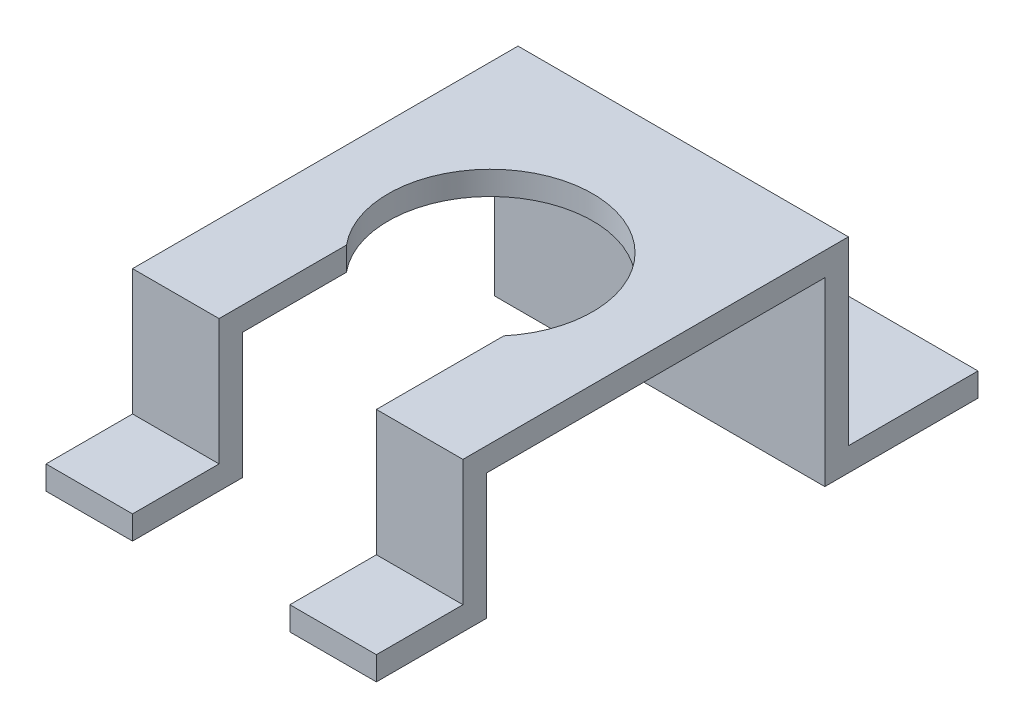
ISO-10303-21;
HEADER;
FILE_DESCRIPTION(('STEP AP214'),'2;1');
FILE_NAME('part.step','',(''),(''),'','','');
FILE_SCHEMA(('AUTOMOTIVE_DESIGN { 1 0 10303 214 1 1 1 1 }'));
ENDSEC;
DATA;
#1=APPLICATION_CONTEXT('core data for automotive mechanical design processes');
#2=APPLICATION_PROTOCOL_DEFINITION('international standard','automotive_design',2000,#1);
#3=PRODUCT_CONTEXT('',#1,'mechanical');
#4=PRODUCT('Part','Part','',(#3));
#5=PRODUCT_RELATED_PRODUCT_CATEGORY('part','',(#4));
#6=PRODUCT_DEFINITION_FORMATION('','',#4);
#7=PRODUCT_DEFINITION_CONTEXT('part definition',#1,'design');
#8=PRODUCT_DEFINITION('design','',#6,#7);
#9=PRODUCT_DEFINITION_SHAPE('','',#8);
#10=(LENGTH_UNIT() NAMED_UNIT(*) SI_UNIT(.MILLI.,.METRE.));
#11=(NAMED_UNIT(*) PLANE_ANGLE_UNIT() SI_UNIT($,.RADIAN.));
#12=(NAMED_UNIT(*) SI_UNIT($,.STERADIAN.) SOLID_ANGLE_UNIT());
#13=UNCERTAINTY_MEASURE_WITH_UNIT(LENGTH_MEASURE(1.E-05),#10,'distance_accuracy_value','');
#14=(GEOMETRIC_REPRESENTATION_CONTEXT(3) GLOBAL_UNCERTAINTY_ASSIGNED_CONTEXT((#13)) GLOBAL_UNIT_ASSIGNED_CONTEXT((#10,
#11,#12)) REPRESENTATION_CONTEXT('',''));
#15=CARTESIAN_POINT('',(0.,0.,0.));
#16=DIRECTION('',(0.,0.,1.));
#17=DIRECTION('',(1.,0.,0.));
#18=AXIS2_PLACEMENT_3D('',#15,#16,#17);
#19=CARTESIAN_POINT('',(42.,26.,-28.5887484860093));
#20=DIRECTION('',(0.,0.,-1.));
#21=DIRECTION('',(0.,1.,0.));
#22=AXIS2_PLACEMENT_3D('',#19,#20,#21);
#23=PLANE('',#22);
#24=DIRECTION('',(-1.,0.,0.));
#25=VECTOR('',#24,1.);
#26=CARTESIAN_POINT('',(42.,10.,-28.5887484860093));
#27=LINE('',#26,#25);
#28=CARTESIAN_POINT('',(11.,10.,-28.5887484860093));
#29=VERTEX_POINT('',#28);
#30=CARTESIAN_POINT('',(0.,10.,-28.5887484860093));
#31=VERTEX_POINT('',#30);
#32=EDGE_CURVE('E279',#29,#31,#27,.T.);
#33=ORIENTED_EDGE('',*,*,#32,.F.);
#34=DIRECTION('',(0.,1.,0.));
#35=VECTOR('',#34,1.);
#36=CARTESIAN_POINT('',(11.,26.,-28.5887484860093));
#37=LINE('',#36,#35);
#38=CARTESIAN_POINT('',(11.,26.,-28.5887484860093));
#39=VERTEX_POINT('',#38);
#40=EDGE_CURVE('E211',#29,#39,#37,.T.);
#41=ORIENTED_EDGE('',*,*,#40,.T.);
#42=DIRECTION('',(-1.,0.,0.));
#43=VECTOR('',#42,1.);
#44=CARTESIAN_POINT('',(42.,26.,-28.5887484860093));
#45=LINE('',#44,#43);
#46=CARTESIAN_POINT('',(0.,26.,-28.5887484860093));
#47=VERTEX_POINT('',#46);
#48=EDGE_CURVE('E284',#39,#47,#45,.T.);
#49=ORIENTED_EDGE('',*,*,#48,.T.);
#50=DIRECTION('',(0.,-1.,0.));
#51=VECTOR('',#50,1.);
#52=CARTESIAN_POINT('',(0.,26.,-28.5887484860093));
#53=LINE('',#52,#51);
#54=EDGE_CURVE('E215',#47,#31,#53,.T.);
#55=ORIENTED_EDGE('',*,*,#54,.T.);
#56=EDGE_LOOP('',(#33,#41,#49,#55));
#57=FACE_BOUND('',#56,.T.);
#58=ADVANCED_FACE('F43',(#57),#23,.F.);
#59=CARTESIAN_POINT('',(42.,10.,-28.5887484860093));
#60=DIRECTION('',(0.,-1.,0.));
#61=DIRECTION('',(0.,0.,-1.));
#62=AXIS2_PLACEMENT_3D('',#59,#60,#61);
#63=PLANE('',#62);
#64=DIRECTION('',(-1.,0.,0.));
#65=VECTOR('',#64,1.);
#66=CARTESIAN_POINT('',(42.,10.,-17.5887484860093));
#67=LINE('',#66,#65);
#68=CARTESIAN_POINT('',(11.,10.,-17.5887484860093));
#69=VERTEX_POINT('',#68);
#70=CARTESIAN_POINT('',(0.,10.,-17.5887484860093));
#71=VERTEX_POINT('',#70);
#72=EDGE_CURVE('E274',#69,#71,#67,.T.);
#73=ORIENTED_EDGE('',*,*,#72,.F.);
#74=DIRECTION('',(0.,0.,-1.));
#75=VECTOR('',#74,1.);
#76=CARTESIAN_POINT('',(11.,10.,-28.5887484860093));
#77=LINE('',#76,#75);
#78=EDGE_CURVE('E359',#69,#29,#77,.T.);
#79=ORIENTED_EDGE('',*,*,#78,.T.);
#80=ORIENTED_EDGE('',*,*,#32,.T.);
#81=DIRECTION('',(0.,0.,1.));
#82=VECTOR('',#81,1.);
#83=CARTESIAN_POINT('',(0.,10.,-28.5887484860093));
#84=LINE('',#83,#82);
#85=EDGE_CURVE('E219',#31,#71,#84,.T.);
#86=ORIENTED_EDGE('',*,*,#85,.T.);
#87=EDGE_LOOP('',(#73,#79,#80,#86));
#88=FACE_BOUND('',#87,.T.);
#89=ADVANCED_FACE('F468',(#88),#63,.F.);
#90=CARTESIAN_POINT('',(42.,10.,-17.5887484860093));
#91=DIRECTION('',(0.,0.,-1.));
#92=DIRECTION('',(-1.,0.,0.));
#93=AXIS2_PLACEMENT_3D('',#90,#91,#92);
#94=PLANE('',#93);
#95=DIRECTION('',(-1.,0.,0.));
#96=VECTOR('',#95,1.);
#97=CARTESIAN_POINT('',(42.,7.,-17.5887484860093));
#98=LINE('',#97,#96);
#99=CARTESIAN_POINT('',(11.,7.,-17.5887484860093));
#100=VERTEX_POINT('',#99);
#101=CARTESIAN_POINT('',(0.,7.,-17.5887484860093));
#102=VERTEX_POINT('',#101);
#103=EDGE_CURVE('E269',#100,#102,#98,.T.);
#104=ORIENTED_EDGE('',*,*,#103,.F.);
#105=DIRECTION('',(0.,1.,0.));
#106=VECTOR('',#105,1.);
#107=CARTESIAN_POINT('',(11.,0.,-17.5887484860093));
#108=LINE('',#107,#106);
#109=EDGE_CURVE('E321',#100,#69,#108,.T.);
#110=ORIENTED_EDGE('',*,*,#109,.T.);
#111=ORIENTED_EDGE('',*,*,#72,.T.);
#112=DIRECTION('',(0.,-1.,0.));
#113=VECTOR('',#112,1.);
#114=CARTESIAN_POINT('',(0.,10.,-17.5887484860093));
#115=LINE('',#114,#113);
#116=EDGE_CURVE('E223',#71,#102,#115,.T.);
#117=ORIENTED_EDGE('',*,*,#116,.T.);
#118=EDGE_LOOP('',(#104,#110,#111,#117));
#119=FACE_BOUND('',#118,.T.);
#120=ADVANCED_FACE('F487',(#119),#94,.F.);
#121=CARTESIAN_POINT('',(42.,7.,-17.5887484860093));
#122=DIRECTION('',(0.,1.,0.));
#123=DIRECTION('',(0.,0.,1.));
#124=AXIS2_PLACEMENT_3D('',#121,#122,#123);
#125=PLANE('',#124);
#126=DIRECTION('',(-1.,0.,0.));
#127=VECTOR('',#126,1.);
#128=CARTESIAN_POINT('',(42.,7.,-31.5887484860093));
#129=LINE('',#128,#127);
#130=CARTESIAN_POINT('',(11.,7.,-31.5887484860093));
#131=VERTEX_POINT('',#130);
#132=CARTESIAN_POINT('',(0.,7.,-31.5887484860093));
#133=VERTEX_POINT('',#132);
#134=EDGE_CURVE('E264',#131,#133,#129,.T.);
#135=ORIENTED_EDGE('',*,*,#134,.F.);
#136=DIRECTION('',(0.,0.,1.));
#137=VECTOR('',#136,1.);
#138=CARTESIAN_POINT('',(11.,7.,-17.5887484860093));
#139=LINE('',#138,#137);
#140=EDGE_CURVE('E355',#131,#100,#139,.T.);
#141=ORIENTED_EDGE('',*,*,#140,.T.);
#142=ORIENTED_EDGE('',*,*,#103,.T.);
#143=DIRECTION('',(0.,0.,-1.));
#144=VECTOR('',#143,1.);
#145=CARTESIAN_POINT('',(0.,7.,-17.5887484860093));
#146=LINE('',#145,#144);
#147=EDGE_CURVE('E227',#102,#133,#146,.T.);
#148=ORIENTED_EDGE('',*,*,#147,.T.);
#149=EDGE_LOOP('',(#135,#141,#142,#148));
#150=FACE_BOUND('',#149,.T.);
#151=ADVANCED_FACE('F484',(#150),#125,.F.);
#152=CARTESIAN_POINT('',(42.,7.,-31.5887484860093));
#153=DIRECTION('',(0.,0.,1.));
#154=DIRECTION('',(1.,0.,0.));
#155=AXIS2_PLACEMENT_3D('',#152,#153,#154);
#156=PLANE('',#155);
#157=DIRECTION('',(-1.,0.,0.));
#158=VECTOR('',#157,1.);
#159=CARTESIAN_POINT('',(42.,23.,-31.5887484860093));
#160=LINE('',#159,#158);
#161=CARTESIAN_POINT('',(11.,23.,-31.5887484860093));
#162=VERTEX_POINT('',#161);
#163=CARTESIAN_POINT('',(0.,23.,-31.5887484860093));
#164=VERTEX_POINT('',#163);
#165=EDGE_CURVE('E259',#162,#164,#160,.T.);
#166=ORIENTED_EDGE('',*,*,#165,.F.);
#167=DIRECTION('',(0.,-1.,0.));
#168=VECTOR('',#167,1.);
#169=CARTESIAN_POINT('',(11.,7.,-31.5887484860093));
#170=LINE('',#169,#168);
#171=EDGE_CURVE('E351',#162,#131,#170,.T.);
#172=ORIENTED_EDGE('',*,*,#171,.T.);
#173=ORIENTED_EDGE('',*,*,#134,.T.);
#174=DIRECTION('',(0.,1.,0.));
#175=VECTOR('',#174,1.);
#176=CARTESIAN_POINT('',(0.,7.,-31.5887484860093));
#177=LINE('',#176,#175);
#178=EDGE_CURVE('E231',#133,#164,#177,.T.);
#179=ORIENTED_EDGE('',*,*,#178,.T.);
#180=EDGE_LOOP('',(#166,#172,#173,#179));
#181=FACE_BOUND('',#180,.T.);
#182=ADVANCED_FACE('F479',(#181),#156,.F.);
#183=CARTESIAN_POINT('',(42.,3.,-77.5887484860093));
#184=DIRECTION('',(0.,0.,1.));
#185=DIRECTION('',(1.,0.,0.));
#186=AXIS2_PLACEMENT_3D('',#183,#184,#185);
#187=PLANE('',#186);
#188=DIRECTION('',(0.,1.,0.));
#189=VECTOR('',#188,1.);
#190=CARTESIAN_POINT('',(0.,3.,-77.5887484860093));
#191=LINE('',#190,#189);
#192=CARTESIAN_POINT('',(0.,3.,-77.5887484860093));
#193=VERTEX_POINT('',#192);
#194=CARTESIAN_POINT('',(0.,26.,-77.5887484860093));
#195=VERTEX_POINT('',#194);
#196=EDGE_CURVE('E206',#193,#195,#191,.T.);
#197=ORIENTED_EDGE('',*,*,#196,.T.);
#198=DIRECTION('',(-1.,0.,0.));
#199=VECTOR('',#198,1.);
#200=CARTESIAN_POINT('',(42.,26.,-77.5887484860093));
#201=LINE('',#200,#199);
#202=CARTESIAN_POINT('',(42.,26.,-77.5887484860093));
#203=VERTEX_POINT('',#202);
#204=EDGE_CURVE('E289',#203,#195,#201,.T.);
#205=ORIENTED_EDGE('',*,*,#204,.F.);
#206=DIRECTION('',(0.,1.,0.));
#207=VECTOR('',#206,1.);
#208=CARTESIAN_POINT('',(42.,3.,-77.5887484860093));
#209=LINE('',#208,#207);
#210=CARTESIAN_POINT('',(42.,3.,-77.5887484860093));
#211=VERTEX_POINT('',#210);
#212=EDGE_CURVE('E248',#211,#203,#209,.T.);
#213=ORIENTED_EDGE('',*,*,#212,.F.);
#214=DIRECTION('',(-1.,0.,0.));
#215=VECTOR('',#214,1.);
#216=CARTESIAN_POINT('',(42.,3.,-77.5887484860093));
#217=LINE('',#216,#215);
#218=EDGE_CURVE('E202',#211,#193,#217,.T.);
#219=ORIENTED_EDGE('',*,*,#218,.T.);
#220=EDGE_LOOP('',(#197,#205,#213,#219));
#221=FACE_BOUND('',#220,.T.);
#222=ADVANCED_FACE('F45',(#221),#187,.F.);
#223=CARTESIAN_POINT('',(42.,26.,-77.5887484860093));
#224=DIRECTION('',(0.,-1.,0.));
#225=DIRECTION('',(0.,0.,-1.));
#226=AXIS2_PLACEMENT_3D('',#223,#224,#225);
#227=PLANE('',#226);
#228=ORIENTED_EDGE('',*,*,#48,.F.);
#229=DIRECTION('',(0.,0.,1.));
#230=VECTOR('',#229,1.);
#231=CARTESIAN_POINT('',(11.,26.,-17.5887484860093));
#232=LINE('',#231,#230);
#233=CARTESIAN_POINT('',(11.,26.,-44.7821246230912));
#234=VERTEX_POINT('',#233);
#235=EDGE_CURVE('E335',#234,#39,#232,.T.);
#236=ORIENTED_EDGE('',*,*,#235,.F.);
#237=CARTESIAN_POINT('',(21.,26.,-53.0887484860093));
#238=DIRECTION('',(0.,1.,0.));
#239=DIRECTION('',(0.,0.,1.));
#240=AXIS2_PLACEMENT_3D('',#237,#238,#239);
#241=CIRCLE('',#240,13.);
#242=CARTESIAN_POINT('',(31.,26.,-44.7821246230912));
#243=VERTEX_POINT('',#242);
#244=EDGE_CURVE('E316',#243,#234,#241,.T.);
#245=ORIENTED_EDGE('',*,*,#244,.F.);
#246=DIRECTION('',(0.,0.,-1.));
#247=VECTOR('',#246,1.);
#248=CARTESIAN_POINT('',(31.,26.,-17.5887484860093));
#249=LINE('',#248,#247);
#250=CARTESIAN_POINT('',(31.,26.,-28.5887484860093));
#251=VERTEX_POINT('',#250);
#252=EDGE_CURVE('E409',#251,#243,#249,.T.);
#253=ORIENTED_EDGE('',*,*,#252,.F.);
#254=CARTESIAN_POINT('',(42.,26.,-28.5887484860093));
#255=VERTEX_POINT('',#254);
#256=EDGE_CURVE('E285',#255,#251,#45,.T.);
#257=ORIENTED_EDGE('',*,*,#256,.F.);
#258=DIRECTION('',(0.,0.,1.));
#259=VECTOR('',#258,1.);
#260=CARTESIAN_POINT('',(42.,26.,-77.5887484860093));
#261=LINE('',#260,#259);
#262=EDGE_CURVE('E142',#203,#255,#261,.T.);
#263=ORIENTED_EDGE('',*,*,#262,.F.);
#264=ORIENTED_EDGE('',*,*,#204,.T.);
#265=DIRECTION('',(0.,0.,1.));
#266=VECTOR('',#265,1.);
#267=CARTESIAN_POINT('',(0.,26.,-77.5887484860093));
#268=LINE('',#267,#266);
#269=EDGE_CURVE('E210',#195,#47,#268,.T.);
#270=ORIENTED_EDGE('',*,*,#269,.T.);
#271=EDGE_LOOP('',(#228,#236,#245,#253,#257,#263,#264,#270));
#272=FACE_BOUND('',#271,.T.);
#273=ADVANCED_FACE('F407',(#272),#227,.F.);
#274=ORIENTED_EDGE('',*,*,#256,.T.);
#275=DIRECTION('',(0.,-1.,0.));
#276=VECTOR('',#275,1.);
#277=CARTESIAN_POINT('',(31.,26.,-28.5887484860093));
#278=LINE('',#277,#276);
#279=CARTESIAN_POINT('',(31.,10.,-28.5887484860093));
#280=VERTEX_POINT('',#279);
#281=EDGE_CURVE('E347',#251,#280,#278,.T.);
#282=ORIENTED_EDGE('',*,*,#281,.T.);
#283=CARTESIAN_POINT('',(42.,10.,-28.5887484860093));
#284=VERTEX_POINT('',#283);
#285=EDGE_CURVE('E280',#284,#280,#27,.T.);
#286=ORIENTED_EDGE('',*,*,#285,.F.);
#287=DIRECTION('',(0.,-1.,0.));
#288=VECTOR('',#287,1.);
#289=CARTESIAN_POINT('',(42.,26.,-28.5887484860093));
#290=LINE('',#289,#288);
#291=EDGE_CURVE('E370',#255,#284,#290,.T.);
#292=ORIENTED_EDGE('',*,*,#291,.F.);
#293=EDGE_LOOP('',(#274,#282,#286,#292));
#294=FACE_BOUND('',#293,.T.);
#295=ADVANCED_FACE('F411',(#294),#23,.F.);
#296=ORIENTED_EDGE('',*,*,#285,.T.);
#297=DIRECTION('',(0.,0.,1.));
#298=VECTOR('',#297,1.);
#299=CARTESIAN_POINT('',(31.,10.,-28.5887484860093));
#300=LINE('',#299,#298);
#301=CARTESIAN_POINT('',(31.,10.,-17.5887484860093));
#302=VERTEX_POINT('',#301);
#303=EDGE_CURVE('E343',#280,#302,#300,.T.);
#304=ORIENTED_EDGE('',*,*,#303,.T.);
#305=CARTESIAN_POINT('',(42.,10.,-17.5887484860093));
#306=VERTEX_POINT('',#305);
#307=EDGE_CURVE('E275',#306,#302,#67,.T.);
#308=ORIENTED_EDGE('',*,*,#307,.F.);
#309=DIRECTION('',(0.,0.,1.));
#310=VECTOR('',#309,1.);
#311=CARTESIAN_POINT('',(42.,10.,-28.5887484860093));
#312=LINE('',#311,#310);
#313=EDGE_CURVE('E373',#284,#306,#312,.T.);
#314=ORIENTED_EDGE('',*,*,#313,.F.);
#315=EDGE_LOOP('',(#296,#304,#308,#314));
#316=FACE_BOUND('',#315,.T.);
#317=ADVANCED_FACE('F416',(#316),#63,.F.);
#318=ORIENTED_EDGE('',*,*,#307,.T.);
#319=DIRECTION('',(0.,1.,0.));
#320=VECTOR('',#319,1.);
#321=CARTESIAN_POINT('',(31.,0.,-17.5887484860093));
#322=LINE('',#321,#320);
#323=CARTESIAN_POINT('',(31.,7.,-17.5887484860093));
#324=VERTEX_POINT('',#323);
#325=EDGE_CURVE('E328',#324,#302,#322,.T.);
#326=ORIENTED_EDGE('',*,*,#325,.F.);
#327=CARTESIAN_POINT('',(42.,7.,-17.5887484860093));
#328=VERTEX_POINT('',#327);
#329=EDGE_CURVE('E270',#328,#324,#98,.T.);
#330=ORIENTED_EDGE('',*,*,#329,.F.);
#331=DIRECTION('',(0.,-1.,0.));
#332=VECTOR('',#331,1.);
#333=CARTESIAN_POINT('',(42.,10.,-17.5887484860093));
#334=LINE('',#333,#332);
#335=EDGE_CURVE('E376',#306,#328,#334,.T.);
#336=ORIENTED_EDGE('',*,*,#335,.F.);
#337=EDGE_LOOP('',(#318,#326,#330,#336));
#338=FACE_BOUND('',#337,.T.);
#339=ADVANCED_FACE('F423',(#338),#94,.F.);
#340=ORIENTED_EDGE('',*,*,#329,.T.);
#341=DIRECTION('',(0.,0.,-1.));
#342=VECTOR('',#341,1.);
#343=CARTESIAN_POINT('',(31.,7.,-17.5887484860093));
#344=LINE('',#343,#342);
#345=CARTESIAN_POINT('',(31.,7.,-31.5887484860093));
#346=VERTEX_POINT('',#345);
#347=EDGE_CURVE('E339',#324,#346,#344,.T.);
#348=ORIENTED_EDGE('',*,*,#347,.T.);
#349=CARTESIAN_POINT('',(42.,7.,-31.5887484860093));
#350=VERTEX_POINT('',#349);
#351=EDGE_CURVE('E265',#350,#346,#129,.T.);
#352=ORIENTED_EDGE('',*,*,#351,.F.);
#353=DIRECTION('',(0.,0.,-1.));
#354=VECTOR('',#353,1.);
#355=CARTESIAN_POINT('',(42.,7.,-17.5887484860093));
#356=LINE('',#355,#354);
#357=EDGE_CURVE('E379',#328,#350,#356,.T.);
#358=ORIENTED_EDGE('',*,*,#357,.F.);
#359=EDGE_LOOP('',(#340,#348,#352,#358));
#360=FACE_BOUND('',#359,.T.);
#361=ADVANCED_FACE('F426',(#360),#125,.F.);
#362=ORIENTED_EDGE('',*,*,#351,.T.);
#363=DIRECTION('',(0.,1.,0.));
#364=VECTOR('',#363,1.);
#365=CARTESIAN_POINT('',(31.,7.,-31.5887484860093));
#366=LINE('',#365,#364);
#367=CARTESIAN_POINT('',(31.,23.,-31.5887484860093));
#368=VERTEX_POINT('',#367);
#369=EDGE_CURVE('E326',#346,#368,#366,.T.);
#370=ORIENTED_EDGE('',*,*,#369,.T.);
#371=CARTESIAN_POINT('',(42.,23.,-31.5887484860093));
#372=VERTEX_POINT('',#371);
#373=EDGE_CURVE('E260',#372,#368,#160,.T.);
#374=ORIENTED_EDGE('',*,*,#373,.F.);
#375=DIRECTION('',(0.,1.,0.));
#376=VECTOR('',#375,1.);
#377=CARTESIAN_POINT('',(42.,7.,-31.5887484860093));
#378=LINE('',#377,#376);
#379=EDGE_CURVE('E382',#350,#372,#378,.T.);
#380=ORIENTED_EDGE('',*,*,#379,.F.);
#381=EDGE_LOOP('',(#362,#370,#374,#380));
#382=FACE_BOUND('',#381,.T.);
#383=ADVANCED_FACE('F430',(#382),#156,.F.);
#384=CARTESIAN_POINT('',(42.,23.,-31.5887484860093));
#385=DIRECTION('',(0.,1.,0.));
#386=DIRECTION('',(0.,0.,1.));
#387=AXIS2_PLACEMENT_3D('',#384,#385,#386);
#388=PLANE('',#387);
#389=CARTESIAN_POINT('',(21.,23.,-53.0887484860093));
#390=DIRECTION('',(0.,1.,0.));
#391=DIRECTION('',(0.,0.,1.));
#392=AXIS2_PLACEMENT_3D('',#389,#390,#391);
#393=CIRCLE('',#392,13.);
#394=CARTESIAN_POINT('',(31.,23.,-44.7821246230912));
#395=VERTEX_POINT('',#394);
#396=CARTESIAN_POINT('',(11.,23.,-44.7821246230912));
#397=VERTEX_POINT('',#396);
#398=EDGE_CURVE('E52',#395,#397,#393,.T.);
#399=ORIENTED_EDGE('',*,*,#398,.T.);
#400=DIRECTION('',(0.,0.,1.));
#401=VECTOR('',#400,1.);
#402=CARTESIAN_POINT('',(11.,23.,-31.5887484860093));
#403=LINE('',#402,#401);
#404=EDGE_CURVE('E11',#397,#162,#403,.T.);
#405=ORIENTED_EDGE('',*,*,#404,.T.);
#406=ORIENTED_EDGE('',*,*,#165,.T.);
#407=DIRECTION('',(0.,0.,-1.));
#408=VECTOR('',#407,1.);
#409=CARTESIAN_POINT('',(0.,23.,-31.5887484860093));
#410=LINE('',#409,#408);
#411=CARTESIAN_POINT('',(0.,23.,-74.5887484860093));
#412=VERTEX_POINT('',#411);
#413=EDGE_CURVE('E235',#164,#412,#410,.T.);
#414=ORIENTED_EDGE('',*,*,#413,.T.);
#415=DIRECTION('',(-1.,0.,0.));
#416=VECTOR('',#415,1.);
#417=CARTESIAN_POINT('',(42.,23.,-74.5887484860093));
#418=LINE('',#417,#416);
#419=CARTESIAN_POINT('',(42.,23.,-74.5887484860093));
#420=VERTEX_POINT('',#419);
#421=EDGE_CURVE('E255',#420,#412,#418,.T.);
#422=ORIENTED_EDGE('',*,*,#421,.F.);
#423=DIRECTION('',(0.,0.,-1.));
#424=VECTOR('',#423,1.);
#425=CARTESIAN_POINT('',(42.,23.,-31.5887484860093));
#426=LINE('',#425,#424);
#427=EDGE_CURVE('E385',#372,#420,#426,.T.);
#428=ORIENTED_EDGE('',*,*,#427,.F.);
#429=ORIENTED_EDGE('',*,*,#373,.T.);
#430=DIRECTION('',(0.,0.,-1.));
#431=VECTOR('',#430,1.);
#432=CARTESIAN_POINT('',(31.,23.,-31.5887484860093));
#433=LINE('',#432,#431);
#434=EDGE_CURVE('E292',#368,#395,#433,.T.);
#435=ORIENTED_EDGE('',*,*,#434,.T.);
#436=EDGE_LOOP('',(#399,#405,#406,#414,#422,#428,#429,#435));
#437=FACE_BOUND('',#436,.T.);
#438=ADVANCED_FACE('F299',(#437),#388,.F.);
#439=CARTESIAN_POINT('',(42.,23.,-74.5887484860093));
#440=DIRECTION('',(0.,0.,-1.));
#441=DIRECTION('',(0.,1.,0.));
#442=AXIS2_PLACEMENT_3D('',#439,#440,#441);
#443=PLANE('',#442);
#444=DIRECTION('',(0.,-1.,0.));
#445=VECTOR('',#444,1.);
#446=CARTESIAN_POINT('',(0.,23.,-74.5887484860093));
#447=LINE('',#446,#445);
#448=CARTESIAN_POINT('',(0.,0.,-74.5887484860093));
#449=VERTEX_POINT('',#448);
#450=EDGE_CURVE('E238',#412,#449,#447,.T.);
#451=ORIENTED_EDGE('',*,*,#450,.T.);
#452=DIRECTION('',(-1.,0.,0.));
#453=VECTOR('',#452,1.);
#454=CARTESIAN_POINT('',(42.,0.,-74.5887484860093));
#455=LINE('',#454,#453);
#456=CARTESIAN_POINT('',(42.,0.,-74.5887484860093));
#457=VERTEX_POINT('',#456);
#458=EDGE_CURVE('E195',#457,#449,#455,.T.);
#459=ORIENTED_EDGE('',*,*,#458,.F.);
#460=DIRECTION('',(0.,-1.,0.));
#461=VECTOR('',#460,1.);
#462=CARTESIAN_POINT('',(42.,23.,-74.5887484860093));
#463=LINE('',#462,#461);
#464=EDGE_CURVE('E181',#420,#457,#463,.T.);
#465=ORIENTED_EDGE('',*,*,#464,.F.);
#466=ORIENTED_EDGE('',*,*,#421,.T.);
#467=EDGE_LOOP('',(#451,#459,#465,#466));
#468=FACE_BOUND('',#467,.T.);
#469=ADVANCED_FACE('F395',(#468),#443,.F.);
#470=CARTESIAN_POINT('',(42.,0.,-74.5887484860093));
#471=DIRECTION('',(0.,1.,0.));
#472=DIRECTION('',(0.,0.,1.));
#473=AXIS2_PLACEMENT_3D('',#470,#471,#472);
#474=PLANE('',#473);
#475=DIRECTION('',(0.,0.,-1.));
#476=VECTOR('',#475,1.);
#477=CARTESIAN_POINT('',(0.,0.,-74.5887484860093));
#478=LINE('',#477,#476);
#479=CARTESIAN_POINT('',(0.,0.,-94.0627689937785));
#480=VERTEX_POINT('',#479);
#481=EDGE_CURVE('E191',#449,#480,#478,.T.);
#482=ORIENTED_EDGE('',*,*,#481,.T.);
#483=DIRECTION('',(-1.,0.,0.));
#484=VECTOR('',#483,1.);
#485=CARTESIAN_POINT('',(42.,0.,-94.0627689937785));
#486=LINE('',#485,#484);
#487=CARTESIAN_POINT('',(42.,0.,-94.0627689937785));
#488=VERTEX_POINT('',#487);
#489=EDGE_CURVE('E188',#488,#480,#486,.T.);
#490=ORIENTED_EDGE('',*,*,#489,.F.);
#491=DIRECTION('',(0.,0.,-1.));
#492=VECTOR('',#491,1.);
#493=CARTESIAN_POINT('',(42.,0.,-74.5887484860093));
#494=LINE('',#493,#492);
#495=EDGE_CURVE('E174',#457,#488,#494,.T.);
#496=ORIENTED_EDGE('',*,*,#495,.F.);
#497=ORIENTED_EDGE('',*,*,#458,.T.);
#498=EDGE_LOOP('',(#482,#490,#496,#497));
#499=FACE_BOUND('',#498,.T.);
#500=ADVANCED_FACE('F189',(#499),#474,.F.);
#501=CARTESIAN_POINT('',(42.,0.,-94.0627689937785));
#502=DIRECTION('',(0.,0.,1.));
#503=DIRECTION('',(1.,0.,0.));
#504=AXIS2_PLACEMENT_3D('',#501,#502,#503);
#505=PLANE('',#504);
#506=DIRECTION('',(0.,1.,0.));
#507=VECTOR('',#506,1.);
#508=CARTESIAN_POINT('',(0.,0.,-94.0627689937785));
#509=LINE('',#508,#507);
#510=CARTESIAN_POINT('',(0.,3.,-94.0627689937785));
#511=VERTEX_POINT('',#510);
#512=EDGE_CURVE('E243',#480,#511,#509,.T.);
#513=ORIENTED_EDGE('',*,*,#512,.T.);
#514=DIRECTION('',(-1.,0.,0.));
#515=VECTOR('',#514,1.);
#516=CARTESIAN_POINT('',(42.,3.,-94.0627689937785));
#517=LINE('',#516,#515);
#518=CARTESIAN_POINT('',(42.,3.,-94.0627689937785));
#519=VERTEX_POINT('',#518);
#520=EDGE_CURVE('E196',#519,#511,#517,.T.);
#521=ORIENTED_EDGE('',*,*,#520,.F.);
#522=DIRECTION('',(0.,1.,0.));
#523=VECTOR('',#522,1.);
#524=CARTESIAN_POINT('',(42.,0.,-94.0627689937785));
#525=LINE('',#524,#523);
#526=EDGE_CURVE('E178',#488,#519,#525,.T.);
#527=ORIENTED_EDGE('',*,*,#526,.F.);
#528=ORIENTED_EDGE('',*,*,#489,.T.);
#529=EDGE_LOOP('',(#513,#521,#527,#528));
#530=FACE_BOUND('',#529,.T.);
#531=ADVANCED_FACE('F198',(#530),#505,.F.);
#532=CARTESIAN_POINT('',(42.,3.,-94.0627689937785));
#533=DIRECTION('',(0.,-1.,0.));
#534=DIRECTION('',(0.,0.,-1.));
#535=AXIS2_PLACEMENT_3D('',#532,#533,#534);
#536=PLANE('',#535);
#537=DIRECTION('',(0.,0.,1.));
#538=VECTOR('',#537,1.);
#539=CARTESIAN_POINT('',(0.,3.,-94.0627689937785));
#540=LINE('',#539,#538);
#541=EDGE_CURVE('E133',#511,#193,#540,.T.);
#542=ORIENTED_EDGE('',*,*,#541,.T.);
#543=ORIENTED_EDGE('',*,*,#218,.F.);
#544=DIRECTION('',(0.,0.,1.));
#545=VECTOR('',#544,1.);
#546=CARTESIAN_POINT('',(42.,3.,-94.0627689937785));
#547=LINE('',#546,#545);
#548=EDGE_CURVE('E74',#519,#211,#547,.T.);
#549=ORIENTED_EDGE('',*,*,#548,.F.);
#550=ORIENTED_EDGE('',*,*,#520,.T.);
#551=EDGE_LOOP('',(#542,#543,#549,#550));
#552=FACE_BOUND('',#551,.T.);
#553=ADVANCED_FACE('F399',(#552),#536,.F.);
#554=CARTESIAN_POINT('',(42.,0.,0.));
#555=DIRECTION('',(1.,0.,0.));
#556=DIRECTION('',(0.,0.,-1.));
#557=AXIS2_PLACEMENT_3D('',#554,#555,#556);
#558=PLANE('',#557);
#559=ORIENTED_EDGE('',*,*,#212,.T.);
#560=ORIENTED_EDGE('',*,*,#262,.T.);
#561=ORIENTED_EDGE('',*,*,#291,.T.);
#562=ORIENTED_EDGE('',*,*,#313,.T.);
#563=ORIENTED_EDGE('',*,*,#335,.T.);
#564=ORIENTED_EDGE('',*,*,#357,.T.);
#565=ORIENTED_EDGE('',*,*,#379,.T.);
#566=ORIENTED_EDGE('',*,*,#427,.T.);
#567=ORIENTED_EDGE('',*,*,#464,.T.);
#568=ORIENTED_EDGE('',*,*,#495,.T.);
#569=ORIENTED_EDGE('',*,*,#526,.T.);
#570=ORIENTED_EDGE('',*,*,#548,.T.);
#571=EDGE_LOOP('',(#559,#560,#561,#562,#563,#564,#565,#566,#567,#568,#569,#570));
#572=FACE_BOUND('',#571,.T.);
#573=ADVANCED_FACE('F176',(#572),#558,.T.);
#574=CARTESIAN_POINT('',(0.,0.,0.));
#575=DIRECTION('',(1.,0.,0.));
#576=DIRECTION('',(0.,0.,-1.));
#577=AXIS2_PLACEMENT_3D('',#574,#575,#576);
#578=PLANE('',#577);
#579=ORIENTED_EDGE('',*,*,#196,.F.);
#580=ORIENTED_EDGE('',*,*,#541,.F.);
#581=ORIENTED_EDGE('',*,*,#512,.F.);
#582=ORIENTED_EDGE('',*,*,#481,.F.);
#583=ORIENTED_EDGE('',*,*,#450,.F.);
#584=ORIENTED_EDGE('',*,*,#413,.F.);
#585=ORIENTED_EDGE('',*,*,#178,.F.);
#586=ORIENTED_EDGE('',*,*,#147,.F.);
#587=ORIENTED_EDGE('',*,*,#116,.F.);
#588=ORIENTED_EDGE('',*,*,#85,.F.);
#589=ORIENTED_EDGE('',*,*,#54,.F.);
#590=ORIENTED_EDGE('',*,*,#269,.F.);
#591=EDGE_LOOP('',(#579,#580,#581,#582,#583,#584,#585,#586,#587,#588,#589,#590));
#592=FACE_BOUND('',#591,.T.);
#593=ADVANCED_FACE('F398',(#592),#578,.F.);
#594=CARTESIAN_POINT('',(11.,0.,-17.5887484860093));
#595=DIRECTION('',(-1.,0.,0.));
#596=DIRECTION('',(0.,0.,1.));
#597=AXIS2_PLACEMENT_3D('',#594,#595,#596);
#598=PLANE('',#597);
#599=ORIENTED_EDGE('',*,*,#78,.F.);
#600=ORIENTED_EDGE('',*,*,#109,.F.);
#601=ORIENTED_EDGE('',*,*,#140,.F.);
#602=ORIENTED_EDGE('',*,*,#171,.F.);
#603=ORIENTED_EDGE('',*,*,#404,.F.);
#604=DIRECTION('',(0.,1.,0.));
#605=VECTOR('',#604,1.);
#606=CARTESIAN_POINT('',(11.,0.,-44.7821246230912));
#607=LINE('',#606,#605);
#608=EDGE_CURVE('E313',#397,#234,#607,.T.);
#609=ORIENTED_EDGE('',*,*,#608,.T.);
#610=ORIENTED_EDGE('',*,*,#235,.T.);
#611=ORIENTED_EDGE('',*,*,#40,.F.);
#612=EDGE_LOOP('',(#599,#600,#601,#602,#603,#609,#610,#611));
#613=FACE_BOUND('',#612,.T.);
#614=ADVANCED_FACE('F463',(#613),#598,.F.);
#615=CARTESIAN_POINT('',(21.,0.,-53.0887484860093));
#616=DIRECTION('',(0.,1.,0.));
#617=DIRECTION('',(0.,0.,1.));
#618=AXIS2_PLACEMENT_3D('',#615,#616,#617);
#619=CYLINDRICAL_SURFACE('',#618,13.);
#620=DIRECTION('',(0.,1.,0.));
#621=VECTOR('',#620,1.);
#622=CARTESIAN_POINT('',(31.,0.,-44.7821246230912));
#623=LINE('',#622,#621);
#624=EDGE_CURVE('E62',#395,#243,#623,.T.);
#625=ORIENTED_EDGE('',*,*,#624,.T.);
#626=ORIENTED_EDGE('',*,*,#244,.T.);
#627=ORIENTED_EDGE('',*,*,#608,.F.);
#628=ORIENTED_EDGE('',*,*,#398,.F.);
#629=EDGE_LOOP('',(#625,#626,#627,#628));
#630=FACE_BOUND('',#629,.T.);
#631=ADVANCED_FACE('F309',(#630),#619,.F.);
#632=CARTESIAN_POINT('',(31.,0.,-17.5887484860093));
#633=DIRECTION('',(1.,0.,0.));
#634=DIRECTION('',(0.,0.,-1.));
#635=AXIS2_PLACEMENT_3D('',#632,#633,#634);
#636=PLANE('',#635);
#637=ORIENTED_EDGE('',*,*,#252,.T.);
#638=ORIENTED_EDGE('',*,*,#624,.F.);
#639=ORIENTED_EDGE('',*,*,#434,.F.);
#640=ORIENTED_EDGE('',*,*,#369,.F.);
#641=ORIENTED_EDGE('',*,*,#347,.F.);
#642=ORIENTED_EDGE('',*,*,#325,.T.);
#643=ORIENTED_EDGE('',*,*,#303,.F.);
#644=ORIENTED_EDGE('',*,*,#281,.F.);
#645=EDGE_LOOP('',(#637,#638,#639,#640,#641,#642,#643,#644));
#646=FACE_BOUND('',#645,.T.);
#647=ADVANCED_FACE('F495',(#646),#636,.F.);
#648=CLOSED_SHELL('',(#58,#89,#120,#151,#182,#222,#273,#295,#317,#339,#361,#383,#438,#469,#500,
#531,#553,#573,#593,#614,#631,#647));
#649=MANIFOLD_SOLID_BREP('B2',#648);
#650=ADVANCED_BREP_SHAPE_REPRESENTATION('',(#18,#649),#14);
#651=SHAPE_DEFINITION_REPRESENTATION(#9,#650);
ENDSEC;
END-ISO-10303-21;
